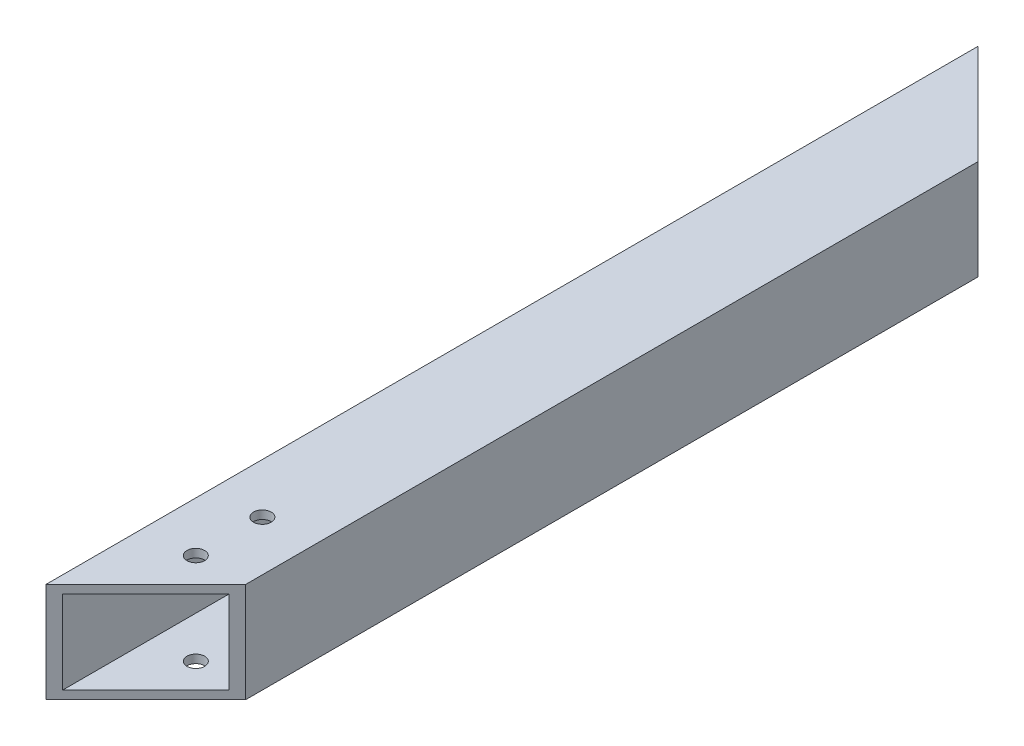
ISO-10303-21;
HEADER;
FILE_DESCRIPTION(('STEP AP214'),'2;1');
FILE_NAME('part.step','',(''),(''),'','','');
FILE_SCHEMA(('AUTOMOTIVE_DESIGN { 1 0 10303 214 1 1 1 1 }'));
ENDSEC;
DATA;
#1=APPLICATION_CONTEXT('core data for automotive mechanical design processes');
#2=APPLICATION_PROTOCOL_DEFINITION('international standard','automotive_design',2000,#1);
#3=PRODUCT_CONTEXT('',#1,'mechanical');
#4=PRODUCT('Part','Part','',(#3));
#5=PRODUCT_RELATED_PRODUCT_CATEGORY('part','',(#4));
#6=PRODUCT_DEFINITION_FORMATION('','',#4);
#7=PRODUCT_DEFINITION_CONTEXT('part definition',#1,'design');
#8=PRODUCT_DEFINITION('design','',#6,#7);
#9=PRODUCT_DEFINITION_SHAPE('','',#8);
#10=(LENGTH_UNIT() NAMED_UNIT(*) SI_UNIT(.MILLI.,.METRE.));
#11=(NAMED_UNIT(*) PLANE_ANGLE_UNIT() SI_UNIT($,.RADIAN.));
#12=(NAMED_UNIT(*) SI_UNIT($,.STERADIAN.) SOLID_ANGLE_UNIT());
#13=UNCERTAINTY_MEASURE_WITH_UNIT(LENGTH_MEASURE(1.E-05),#10,'distance_accuracy_value','');
#14=(GEOMETRIC_REPRESENTATION_CONTEXT(3) GLOBAL_UNCERTAINTY_ASSIGNED_CONTEXT((#13)) GLOBAL_UNIT_ASSIGNED_CONTEXT((#10,
#11,#12)) REPRESENTATION_CONTEXT('',''));
#15=CARTESIAN_POINT('',(0.,0.,0.));
#16=DIRECTION('',(0.,0.,1.));
#17=DIRECTION('',(1.,0.,0.));
#18=AXIS2_PLACEMENT_3D('',#15,#16,#17);
#19=CARTESIAN_POINT('',(1.04780184528863E-09,-356.483977366186,177.800000004783));
#20=DIRECTION('',(0.,1.,0.));
#21=DIRECTION('',(1.,0.,0.));
#22=AXIS2_PLACEMENT_3D('',#19,#20,#21);
#23=CYLINDRICAL_SURFACE('',#22,3.3782);
#24=CARTESIAN_POINT('',(1.04780184528863E-09,0.,177.800000004783));
#25=DIRECTION('',(0.,1.,0.));
#26=DIRECTION('',(1.,0.,0.));
#27=AXIS2_PLACEMENT_3D('',#24,#25,#26);
#28=CIRCLE('',#27,3.3782);
#29=CARTESIAN_POINT('',(3.3782000010478,0.,177.800000004783));
#30=VERTEX_POINT('',#29);
#31=EDGE_CURVE('E144',#30,#30,#28,.T.);
#32=ORIENTED_EDGE('',*,*,#31,.F.);
#33=EDGE_LOOP('',(#32));
#34=FACE_BOUND('',#33,.T.);
#35=CARTESIAN_POINT('',(1.04780184528863E-09,3.17500000000003,177.800000004783));
#36=DIRECTION('',(0.,-1.,0.));
#37=DIRECTION('',(0.,0.,-1.));
#38=AXIS2_PLACEMENT_3D('',#35,#36,#37);
#39=CIRCLE('',#38,3.3782);
#40=CARTESIAN_POINT('',(1.04780184528863E-09,3.17500000000003,174.421800004783));
#41=VERTEX_POINT('',#40);
#42=EDGE_CURVE('E110',#41,#41,#39,.T.);
#43=ORIENTED_EDGE('',*,*,#42,.F.);
#44=EDGE_LOOP('',(#43));
#45=FACE_BOUND('',#44,.T.);
#46=ADVANCED_FACE('F16',(#34,#45),#23,.F.);
#47=CARTESIAN_POINT('',(8.50393089280033E-10,-356.483977366186,152.400000004784));
#48=DIRECTION('',(0.,1.,0.));
#49=DIRECTION('',(1.,0.,0.));
#50=AXIS2_PLACEMENT_3D('',#47,#48,#49);
#51=CYLINDRICAL_SURFACE('',#50,3.3782);
#52=CARTESIAN_POINT('',(8.50393089280033E-10,0.,152.400000004784));
#53=DIRECTION('',(0.,1.,0.));
#54=DIRECTION('',(1.,0.,0.));
#55=AXIS2_PLACEMENT_3D('',#52,#53,#54);
#56=CIRCLE('',#55,3.3782);
#57=CARTESIAN_POINT('',(3.37820000085039,0.,152.400000004784));
#58=VERTEX_POINT('',#57);
#59=EDGE_CURVE('E164',#58,#58,#56,.T.);
#60=ORIENTED_EDGE('',*,*,#59,.F.);
#61=EDGE_LOOP('',(#60));
#62=FACE_BOUND('',#61,.T.);
#63=CARTESIAN_POINT('',(8.50393089280033E-10,3.17500000000003,152.400000004784));
#64=DIRECTION('',(0.,-1.,0.));
#65=DIRECTION('',(0.,0.,-1.));
#66=AXIS2_PLACEMENT_3D('',#63,#64,#65);
#67=CIRCLE('',#66,3.3782);
#68=CARTESIAN_POINT('',(8.50393089280033E-10,3.17500000000003,149.021800004784));
#69=VERTEX_POINT('',#68);
#70=EDGE_CURVE('E106',#69,#69,#67,.T.);
#71=ORIENTED_EDGE('',*,*,#70,.F.);
#72=EDGE_LOOP('',(#71));
#73=FACE_BOUND('',#72,.T.);
#74=ADVANCED_FACE('F188',(#62,#73),#51,.F.);
#75=CARTESIAN_POINT('',(1.04780184528863E-09,-321.558977366186,177.800000004783));
#76=DIRECTION('',(0.,1.,0.));
#77=DIRECTION('',(1.,0.,0.));
#78=AXIS2_PLACEMENT_3D('',#75,#76,#77);
#79=CYLINDRICAL_SURFACE('',#78,3.3782);
#80=CARTESIAN_POINT('',(1.04780184528863E-09,34.925,177.800000004783));
#81=DIRECTION('',(0.,1.,0.));
#82=DIRECTION('',(1.,0.,0.));
#83=AXIS2_PLACEMENT_3D('',#80,#81,#82);
#84=CIRCLE('',#83,3.3782);
#85=CARTESIAN_POINT('',(3.3782000010478,34.925,177.800000004783));
#86=VERTEX_POINT('',#85);
#87=EDGE_CURVE('E137',#86,#86,#84,.T.);
#88=ORIENTED_EDGE('',*,*,#87,.F.);
#89=EDGE_LOOP('',(#88));
#90=FACE_BOUND('',#89,.T.);
#91=CARTESIAN_POINT('',(1.04780184528863E-09,38.1,177.800000004783));
#92=DIRECTION('',(0.,-1.,0.));
#93=DIRECTION('',(0.,0.,-1.));
#94=AXIS2_PLACEMENT_3D('',#91,#92,#93);
#95=CIRCLE('',#94,3.3782);
#96=CARTESIAN_POINT('',(1.04780184528863E-09,38.1,174.421800004783));
#97=VERTEX_POINT('',#96);
#98=EDGE_CURVE('E122',#97,#97,#95,.T.);
#99=ORIENTED_EDGE('',*,*,#98,.F.);
#100=EDGE_LOOP('',(#99));
#101=FACE_BOUND('',#100,.T.);
#102=ADVANCED_FACE('F185',(#90,#101),#79,.F.);
#103=CARTESIAN_POINT('',(8.50395309726082E-10,-321.558977366186,152.400000004784));
#104=DIRECTION('',(0.,1.,0.));
#105=DIRECTION('',(1.,0.,0.));
#106=AXIS2_PLACEMENT_3D('',#103,#104,#105);
#107=CYLINDRICAL_SURFACE('',#106,3.3782);
#108=CARTESIAN_POINT('',(8.50395309726082E-10,34.925,152.400000004784));
#109=DIRECTION('',(0.,1.,0.));
#110=DIRECTION('',(1.,0.,0.));
#111=AXIS2_PLACEMENT_3D('',#108,#109,#110);
#112=CIRCLE('',#111,3.3782);
#113=CARTESIAN_POINT('',(3.3782000008504,34.925,152.400000004784));
#114=VERTEX_POINT('',#113);
#115=EDGE_CURVE('E166',#114,#114,#112,.T.);
#116=ORIENTED_EDGE('',*,*,#115,.F.);
#117=EDGE_LOOP('',(#116));
#118=FACE_BOUND('',#117,.T.);
#119=CARTESIAN_POINT('',(8.50395309726082E-10,38.1,152.400000004784));
#120=DIRECTION('',(0.,-1.,0.));
#121=DIRECTION('',(0.,0.,-1.));
#122=AXIS2_PLACEMENT_3D('',#119,#120,#121);
#123=CIRCLE('',#122,3.3782);
#124=CARTESIAN_POINT('',(8.50395309726082E-10,38.1,149.021800004784));
#125=VERTEX_POINT('',#124);
#126=EDGE_CURVE('E177',#125,#125,#123,.T.);
#127=ORIENTED_EDGE('',*,*,#126,.F.);
#128=EDGE_LOOP('',(#127));
#129=FACE_BOUND('',#128,.T.);
#130=ADVANCED_FACE('F187',(#118,#129),#107,.F.);
#131=CARTESIAN_POINT('',(-19.05,-0.00100000000000211,-139.7));
#132=DIRECTION('',(-0.707106781191258,0.,0.707106781181837));
#133=DIRECTION('',(0.707106781181837,0.,0.707106781191258));
#134=AXIS2_PLACEMENT_3D('',#131,#132,#133);
#135=PLANE('',#134);
#136=DIRECTION('',(0.,1.,0.));
#137=VECTOR('',#136,1.);
#138=CARTESIAN_POINT('',(-19.05,0.,-139.7));
#139=LINE('',#138,#137);
#140=CARTESIAN_POINT('',(-19.05,0.,-139.7));
#141=VERTEX_POINT('',#140);
#142=CARTESIAN_POINT('',(-19.05,38.1,-139.7));
#143=VERTEX_POINT('',#142);
#144=EDGE_CURVE('E11',#141,#143,#139,.T.);
#145=ORIENTED_EDGE('',*,*,#144,.T.);
#146=DIRECTION('',(-0.707106781181837,0.,-0.707106781191258));
#147=VECTOR('',#146,1.);
#148=CARTESIAN_POINT('',(20.6374999999366,38.1,-100.012499999535));
#149=LINE('',#148,#147);
#150=CARTESIAN_POINT('',(19.05,38.1,-101.599999999492));
#151=VERTEX_POINT('',#150);
#152=EDGE_CURVE('E35',#151,#143,#149,.T.);
#153=ORIENTED_EDGE('',*,*,#152,.F.);
#154=DIRECTION('',(0.,1.,0.));
#155=VECTOR('',#154,1.);
#156=CARTESIAN_POINT('',(19.05,-0.000500000000001055,-101.599999999492));
#157=LINE('',#156,#155);
#158=CARTESIAN_POINT('',(19.05,0.,-101.599999999492));
#159=VERTEX_POINT('',#158);
#160=EDGE_CURVE('E26',#159,#151,#157,.T.);
#161=ORIENTED_EDGE('',*,*,#160,.F.);
#162=DIRECTION('',(0.707106781181837,0.,0.707106781191258));
#163=VECTOR('',#162,1.);
#164=CARTESIAN_POINT('',(20.6374999999366,0.,-100.012499999535));
#165=LINE('',#164,#163);
#166=EDGE_CURVE('E125',#141,#159,#165,.T.);
#167=ORIENTED_EDGE('',*,*,#166,.F.);
#168=EDGE_LOOP('',(#145,#153,#161,#167));
#169=FACE_BOUND('',#168,.T.);
#170=DIRECTION('',(0.,-1.,0.));
#171=VECTOR('',#170,1.);
#172=CARTESIAN_POINT('',(15.875,-0.000500000000001055,-104.774999999535));
#173=LINE('',#172,#171);
#174=CARTESIAN_POINT('',(15.875,34.925,-104.774999999535));
#175=VERTEX_POINT('',#174);
#176=CARTESIAN_POINT('',(15.875,3.175,-104.774999999535));
#177=VERTEX_POINT('',#176);
#178=EDGE_CURVE('E98',#175,#177,#173,.T.);
#179=ORIENTED_EDGE('',*,*,#178,.F.);
#180=DIRECTION('',(0.707106781181837,0.,0.707106781191258));
#181=VECTOR('',#180,1.);
#182=CARTESIAN_POINT('',(20.6374999999366,34.925,-100.012499999535));
#183=LINE('',#182,#181);
#184=CARTESIAN_POINT('',(-15.875,34.925,-136.524999999958));
#185=VERTEX_POINT('',#184);
#186=EDGE_CURVE('E140',#185,#175,#183,.T.);
#187=ORIENTED_EDGE('',*,*,#186,.F.);
#188=DIRECTION('',(0.,1.,0.));
#189=VECTOR('',#188,1.);
#190=CARTESIAN_POINT('',(-15.875,-0.000500000000001055,-136.524999999958));
#191=LINE('',#190,#189);
#192=CARTESIAN_POINT('',(-15.875,3.175,-136.524999999958));
#193=VERTEX_POINT('',#192);
#194=EDGE_CURVE('E114',#193,#185,#191,.T.);
#195=ORIENTED_EDGE('',*,*,#194,.F.);
#196=DIRECTION('',(-0.707106781181837,0.,-0.707106781191258));
#197=VECTOR('',#196,1.);
#198=CARTESIAN_POINT('',(20.6374999999366,3.175,-100.012499999535));
#199=LINE('',#198,#197);
#200=EDGE_CURVE('E105',#177,#193,#199,.T.);
#201=ORIENTED_EDGE('',*,*,#200,.F.);
#202=EDGE_LOOP('',(#179,#187,#195,#201));
#203=FACE_BOUND('',#202,.T.);
#204=ADVANCED_FACE('F196',(#169,#203),#135,.F.);
#205=CARTESIAN_POINT('',(19.05,0.,215.9));
#206=DIRECTION('',(1.,0.,0.));
#207=DIRECTION('',(0.,0.,-1.));
#208=AXIS2_PLACEMENT_3D('',#205,#206,#207);
#209=PLANE('',#208);
#210=ORIENTED_EDGE('',*,*,#160,.T.);
#211=DIRECTION('',(0.,0.,-1.));
#212=VECTOR('',#211,1.);
#213=CARTESIAN_POINT('',(19.05,38.1,-215.9));
#214=LINE('',#213,#212);
#215=CARTESIAN_POINT('',(19.05,38.1,177.799999998858));
#216=VERTEX_POINT('',#215);
#217=EDGE_CURVE('E116',#216,#151,#214,.T.);
#218=ORIENTED_EDGE('',*,*,#217,.F.);
#219=DIRECTION('',(0.,-1.,0.));
#220=VECTOR('',#219,1.);
#221=CARTESIAN_POINT('',(19.05,-0.000500000000001055,177.799999998858));
#222=LINE('',#221,#220);
#223=CARTESIAN_POINT('',(19.05,0.,177.799999998858));
#224=VERTEX_POINT('',#223);
#225=EDGE_CURVE('E119',#216,#224,#222,.T.);
#226=ORIENTED_EDGE('',*,*,#225,.T.);
#227=DIRECTION('',(0.,0.,1.));
#228=VECTOR('',#227,1.);
#229=CARTESIAN_POINT('',(19.05,0.,-215.9));
#230=LINE('',#229,#228);
#231=EDGE_CURVE('E123',#159,#224,#230,.T.);
#232=ORIENTED_EDGE('',*,*,#231,.F.);
#233=EDGE_LOOP('',(#210,#218,#226,#232));
#234=FACE_BOUND('',#233,.T.);
#235=ADVANCED_FACE('F156',(#234),#209,.T.);
#236=CARTESIAN_POINT('',(0.,38.1,0.));
#237=DIRECTION('',(0.,1.,0.));
#238=DIRECTION('',(0.,0.,1.));
#239=AXIS2_PLACEMENT_3D('',#236,#237,#238);
#240=PLANE('',#239);
#241=ORIENTED_EDGE('',*,*,#98,.T.);
#242=EDGE_LOOP('',(#241));
#243=FACE_BOUND('',#242,.T.);
#244=ORIENTED_EDGE('',*,*,#126,.T.);
#245=EDGE_LOOP('',(#244));
#246=FACE_BOUND('',#245,.T.);
#247=ORIENTED_EDGE('',*,*,#152,.T.);
#248=DIRECTION('',(0.,0.,1.));
#249=VECTOR('',#248,1.);
#250=CARTESIAN_POINT('',(-19.05,38.1,215.9));
#251=LINE('',#250,#249);
#252=CARTESIAN_POINT('',(-19.05,38.1,215.9));
#253=VERTEX_POINT('',#252);
#254=EDGE_CURVE('E127',#143,#253,#251,.T.);
#255=ORIENTED_EDGE('',*,*,#254,.T.);
#256=DIRECTION('',(0.707106781175949,0.,-0.707106781197146));
#257=VECTOR('',#256,1.);
#258=CARTESIAN_POINT('',(39.6874999998572,38.1,157.162499998382));
#259=LINE('',#258,#257);
#260=EDGE_CURVE('E118',#253,#216,#259,.T.);
#261=ORIENTED_EDGE('',*,*,#260,.T.);
#262=ORIENTED_EDGE('',*,*,#217,.T.);
#263=EDGE_LOOP('',(#247,#255,#261,#262));
#264=FACE_BOUND('',#263,.T.);
#265=ADVANCED_FACE('F153',(#243,#246,#264),#240,.T.);
#266=CARTESIAN_POINT('',(-15.875,0.,-215.9));
#267=DIRECTION('',(-1.,0.,0.));
#268=DIRECTION('',(0.,0.,1.));
#269=AXIS2_PLACEMENT_3D('',#266,#267,#268);
#270=PLANE('',#269);
#271=ORIENTED_EDGE('',*,*,#194,.T.);
#272=DIRECTION('',(0.,0.,1.));
#273=VECTOR('',#272,1.);
#274=CARTESIAN_POINT('',(-15.875,34.925,-107.95));
#275=LINE('',#274,#273);
#276=CARTESIAN_POINT('',(-15.875,34.925,212.724999999905));
#277=VERTEX_POINT('',#276);
#278=EDGE_CURVE('E131',#185,#277,#275,.T.);
#279=ORIENTED_EDGE('',*,*,#278,.T.);
#280=DIRECTION('',(0.,-1.,0.));
#281=VECTOR('',#280,1.);
#282=CARTESIAN_POINT('',(-15.875,-0.000500000000001055,212.724999999905));
#283=LINE('',#282,#281);
#284=CARTESIAN_POINT('',(-15.875,3.175,212.724999999905));
#285=VERTEX_POINT('',#284);
#286=EDGE_CURVE('E134',#277,#285,#283,.T.);
#287=ORIENTED_EDGE('',*,*,#286,.T.);
#288=DIRECTION('',(0.,0.,-1.));
#289=VECTOR('',#288,1.);
#290=CARTESIAN_POINT('',(-15.875,3.175,-76.2));
#291=LINE('',#290,#289);
#292=EDGE_CURVE('E103',#285,#193,#291,.T.);
#293=ORIENTED_EDGE('',*,*,#292,.T.);
#294=EDGE_LOOP('',(#271,#279,#287,#293));
#295=FACE_BOUND('',#294,.T.);
#296=ADVANCED_FACE('F263',(#295),#270,.F.);
#297=CARTESIAN_POINT('',(0.,34.925,0.));
#298=DIRECTION('',(0.,1.,0.));
#299=DIRECTION('',(0.,0.,1.));
#300=AXIS2_PLACEMENT_3D('',#297,#298,#299);
#301=PLANE('',#300);
#302=ORIENTED_EDGE('',*,*,#87,.T.);
#303=EDGE_LOOP('',(#302));
#304=FACE_BOUND('',#303,.T.);
#305=ORIENTED_EDGE('',*,*,#115,.T.);
#306=EDGE_LOOP('',(#305));
#307=FACE_BOUND('',#306,.T.);
#308=ORIENTED_EDGE('',*,*,#186,.T.);
#309=DIRECTION('',(0.,0.,-1.));
#310=VECTOR('',#309,1.);
#311=CARTESIAN_POINT('',(15.875,34.925,107.95));
#312=LINE('',#311,#310);
#313=CARTESIAN_POINT('',(15.875,34.925,180.974999998953));
#314=VERTEX_POINT('',#313);
#315=EDGE_CURVE('E94',#314,#175,#312,.T.);
#316=ORIENTED_EDGE('',*,*,#315,.F.);
#317=DIRECTION('',(-0.707106781175949,0.,0.707106781197146));
#318=VECTOR('',#317,1.);
#319=CARTESIAN_POINT('',(39.6874999998572,34.925,157.162499998382));
#320=LINE('',#319,#318);
#321=EDGE_CURVE('E90',#314,#277,#320,.T.);
#322=ORIENTED_EDGE('',*,*,#321,.T.);
#323=ORIENTED_EDGE('',*,*,#278,.F.);
#324=EDGE_LOOP('',(#308,#316,#322,#323));
#325=FACE_BOUND('',#324,.T.);
#326=ADVANCED_FACE('F227',(#304,#307,#325),#301,.F.);
#327=CARTESIAN_POINT('',(-19.05,0.,-215.9));
#328=DIRECTION('',(-1.,0.,0.));
#329=DIRECTION('',(0.,0.,1.));
#330=AXIS2_PLACEMENT_3D('',#327,#328,#329);
#331=PLANE('',#330);
#332=DIRECTION('',(0.,0.,-1.));
#333=VECTOR('',#332,1.);
#334=CARTESIAN_POINT('',(-19.05,0.,-76.2));
#335=LINE('',#334,#333);
#336=CARTESIAN_POINT('',(-19.05,0.,215.9));
#337=VERTEX_POINT('',#336);
#338=EDGE_CURVE('E78',#337,#141,#335,.T.);
#339=ORIENTED_EDGE('',*,*,#338,.F.);
#340=DIRECTION('',(0.,1.,0.));
#341=VECTOR('',#340,1.);
#342=CARTESIAN_POINT('',(-19.05,0.,215.9));
#343=LINE('',#342,#341);
#344=EDGE_CURVE('E141',#337,#253,#343,.T.);
#345=ORIENTED_EDGE('',*,*,#344,.T.);
#346=ORIENTED_EDGE('',*,*,#254,.F.);
#347=ORIENTED_EDGE('',*,*,#144,.F.);
#348=EDGE_LOOP('',(#339,#345,#346,#347));
#349=FACE_BOUND('',#348,.T.);
#350=ADVANCED_FACE('F152',(#349),#331,.T.);
#351=CARTESIAN_POINT('',(0.,0.,0.));
#352=DIRECTION('',(0.,1.,0.));
#353=DIRECTION('',(0.,0.,1.));
#354=AXIS2_PLACEMENT_3D('',#351,#352,#353);
#355=PLANE('',#354);
#356=ORIENTED_EDGE('',*,*,#31,.T.);
#357=EDGE_LOOP('',(#356));
#358=FACE_BOUND('',#357,.T.);
#359=ORIENTED_EDGE('',*,*,#59,.T.);
#360=EDGE_LOOP('',(#359));
#361=FACE_BOUND('',#360,.T.);
#362=ORIENTED_EDGE('',*,*,#166,.T.);
#363=ORIENTED_EDGE('',*,*,#231,.T.);
#364=DIRECTION('',(-0.707106781175949,0.,0.707106781197146));
#365=VECTOR('',#364,1.);
#366=CARTESIAN_POINT('',(39.6874999998572,0.,157.162499998382));
#367=LINE('',#366,#365);
#368=EDGE_CURVE('E126',#224,#337,#367,.T.);
#369=ORIENTED_EDGE('',*,*,#368,.T.);
#370=ORIENTED_EDGE('',*,*,#338,.T.);
#371=EDGE_LOOP('',(#362,#363,#369,#370));
#372=FACE_BOUND('',#371,.T.);
#373=ADVANCED_FACE('F148',(#358,#361,#372),#355,.F.);
#374=CARTESIAN_POINT('',(15.875,0.,215.9));
#375=DIRECTION('',(1.,0.,0.));
#376=DIRECTION('',(0.,0.,-1.));
#377=AXIS2_PLACEMENT_3D('',#374,#375,#376);
#378=PLANE('',#377);
#379=ORIENTED_EDGE('',*,*,#178,.T.);
#380=DIRECTION('',(0.,0.,1.));
#381=VECTOR('',#380,1.);
#382=CARTESIAN_POINT('',(15.875,3.175,107.95));
#383=LINE('',#382,#381);
#384=CARTESIAN_POINT('',(15.875,3.175,180.974999998953));
#385=VERTEX_POINT('',#384);
#386=EDGE_CURVE('E93',#177,#385,#383,.T.);
#387=ORIENTED_EDGE('',*,*,#386,.T.);
#388=DIRECTION('',(0.,1.,0.));
#389=VECTOR('',#388,1.);
#390=CARTESIAN_POINT('',(15.875,-0.000500000000001055,180.974999998953));
#391=LINE('',#390,#389);
#392=EDGE_CURVE('E85',#385,#314,#391,.T.);
#393=ORIENTED_EDGE('',*,*,#392,.T.);
#394=ORIENTED_EDGE('',*,*,#315,.T.);
#395=EDGE_LOOP('',(#379,#387,#393,#394));
#396=FACE_BOUND('',#395,.T.);
#397=ADVANCED_FACE('F97',(#396),#378,.F.);
#398=CARTESIAN_POINT('',(0.,3.175,0.));
#399=DIRECTION('',(0.,1.,0.));
#400=DIRECTION('',(0.,0.,1.));
#401=AXIS2_PLACEMENT_3D('',#398,#399,#400);
#402=PLANE('',#401);
#403=ORIENTED_EDGE('',*,*,#42,.T.);
#404=EDGE_LOOP('',(#403));
#405=FACE_BOUND('',#404,.T.);
#406=ORIENTED_EDGE('',*,*,#70,.T.);
#407=EDGE_LOOP('',(#406));
#408=FACE_BOUND('',#407,.T.);
#409=ORIENTED_EDGE('',*,*,#200,.T.);
#410=ORIENTED_EDGE('',*,*,#292,.F.);
#411=DIRECTION('',(0.707106781175949,0.,-0.707106781197146));
#412=VECTOR('',#411,1.);
#413=CARTESIAN_POINT('',(39.6874999998572,3.175,157.162499998382));
#414=LINE('',#413,#412);
#415=EDGE_CURVE('E20',#285,#385,#414,.T.);
#416=ORIENTED_EDGE('',*,*,#415,.T.);
#417=ORIENTED_EDGE('',*,*,#386,.F.);
#418=EDGE_LOOP('',(#409,#410,#416,#417));
#419=FACE_BOUND('',#418,.T.);
#420=ADVANCED_FACE('F101',(#405,#408,#419),#402,.T.);
#421=CARTESIAN_POINT('',(-19.05,-0.00100000000000211,215.9));
#422=DIRECTION('',(0.707106781197146,0.,0.707106781175949));
#423=DIRECTION('',(0.707106781175949,0.,-0.707106781197146));
#424=AXIS2_PLACEMENT_3D('',#421,#422,#423);
#425=PLANE('',#424);
#426=ORIENTED_EDGE('',*,*,#392,.F.);
#427=ORIENTED_EDGE('',*,*,#415,.F.);
#428=ORIENTED_EDGE('',*,*,#286,.F.);
#429=ORIENTED_EDGE('',*,*,#321,.F.);
#430=EDGE_LOOP('',(#426,#427,#428,#429));
#431=FACE_BOUND('',#430,.T.);
#432=ORIENTED_EDGE('',*,*,#225,.F.);
#433=ORIENTED_EDGE('',*,*,#260,.F.);
#434=ORIENTED_EDGE('',*,*,#344,.F.);
#435=ORIENTED_EDGE('',*,*,#368,.F.);
#436=EDGE_LOOP('',(#432,#433,#434,#435));
#437=FACE_BOUND('',#436,.T.);
#438=ADVANCED_FACE('F18',(#431,#437),#425,.T.);
#439=CLOSED_SHELL('',(#46,#74,#102,#130,#204,#235,#265,#296,#326,#350,#373,#397,#420,#438));
#440=MANIFOLD_SOLID_BREP('B1',#439);
#441=ADVANCED_BREP_SHAPE_REPRESENTATION('',(#18,#440),#14);
#442=SHAPE_DEFINITION_REPRESENTATION(#9,#441);
ENDSEC;
END-ISO-10303-21;
